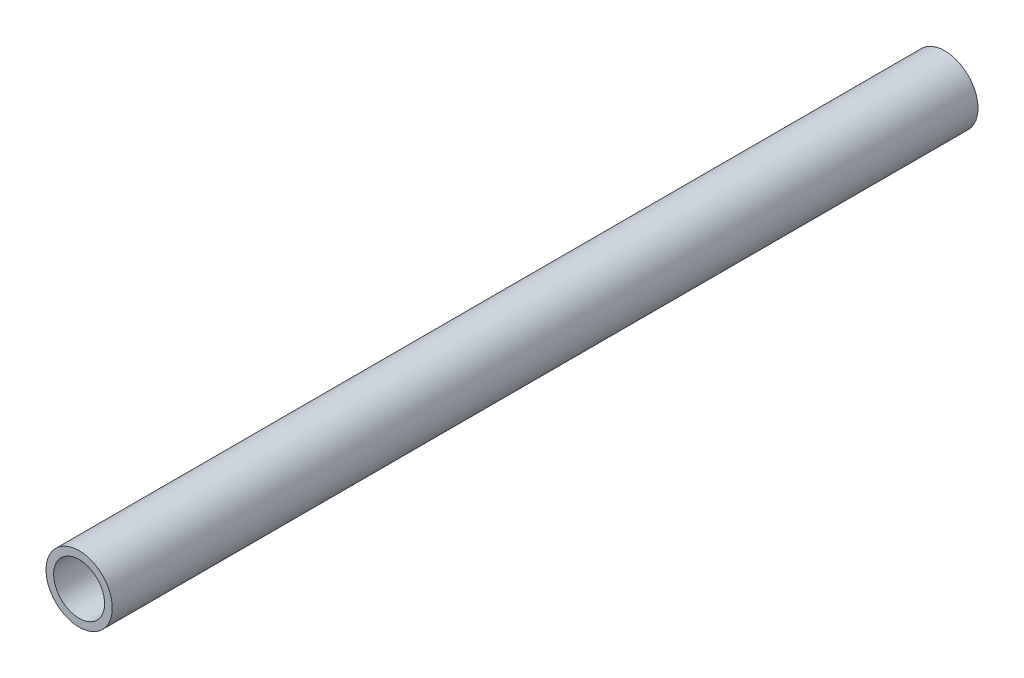
ISO-10303-21;
HEADER;
FILE_DESCRIPTION(('STEP AP214'),'2;1');
FILE_NAME('part.step','',(''),(''),'','','');
FILE_SCHEMA(('AUTOMOTIVE_DESIGN { 1 0 10303 214 1 1 1 1 }'));
ENDSEC;
DATA;
#1=APPLICATION_CONTEXT('core data for automotive mechanical design processes');
#2=APPLICATION_PROTOCOL_DEFINITION('international standard','automotive_design',2000,#1);
#3=PRODUCT_CONTEXT('',#1,'mechanical');
#4=PRODUCT('Part','Part','',(#3));
#5=PRODUCT_RELATED_PRODUCT_CATEGORY('part','',(#4));
#6=PRODUCT_DEFINITION_FORMATION('','',#4);
#7=PRODUCT_DEFINITION_CONTEXT('part definition',#1,'design');
#8=PRODUCT_DEFINITION('design','',#6,#7);
#9=PRODUCT_DEFINITION_SHAPE('','',#8);
#10=(LENGTH_UNIT() NAMED_UNIT(*) SI_UNIT(.MILLI.,.METRE.));
#11=(NAMED_UNIT(*) PLANE_ANGLE_UNIT() SI_UNIT($,.RADIAN.));
#12=(NAMED_UNIT(*) SI_UNIT($,.STERADIAN.) SOLID_ANGLE_UNIT());
#13=UNCERTAINTY_MEASURE_WITH_UNIT(LENGTH_MEASURE(1.E-05),#10,'distance_accuracy_value','');
#14=(GEOMETRIC_REPRESENTATION_CONTEXT(3) GLOBAL_UNCERTAINTY_ASSIGNED_CONTEXT((#13)) GLOBAL_UNIT_ASSIGNED_CONTEXT((#10,
#11,#12)) REPRESENTATION_CONTEXT('',''));
#15=CARTESIAN_POINT('',(0.,0.,0.));
#16=DIRECTION('',(0.,0.,1.));
#17=DIRECTION('',(1.,0.,0.));
#18=AXIS2_PLACEMENT_3D('',#15,#16,#17);
#19=CARTESIAN_POINT('',(0.,0.,0.));
#20=DIRECTION('',(0.,0.,1.));
#21=DIRECTION('',(1.,0.,0.));
#22=AXIS2_PLACEMENT_3D('',#19,#20,#21);
#23=PLANE('',#22);
#24=CARTESIAN_POINT('',(0.,0.,0.));
#25=DIRECTION('',(0.,0.,1.));
#26=DIRECTION('',(1.,0.,0.));
#27=AXIS2_PLACEMENT_3D('',#24,#25,#26);
#28=CIRCLE('',#27,16.51);
#29=CARTESIAN_POINT('',(16.51,0.,0.));
#30=VERTEX_POINT('',#29);
#31=EDGE_CURVE('E38',#30,#30,#28,.T.);
#32=ORIENTED_EDGE('',*,*,#31,.F.);
#33=EDGE_LOOP('',(#32));
#34=FACE_BOUND('',#33,.T.);
#35=CARTESIAN_POINT('',(0.,0.,0.));
#36=DIRECTION('',(0.,0.,1.));
#37=DIRECTION('',(1.,0.,0.));
#38=AXIS2_PLACEMENT_3D('',#35,#36,#37);
#39=CIRCLE('',#38,12.7);
#40=CARTESIAN_POINT('',(12.7,0.,0.));
#41=VERTEX_POINT('',#40);
#42=EDGE_CURVE('E47',#41,#41,#39,.T.);
#43=ORIENTED_EDGE('',*,*,#42,.T.);
#44=EDGE_LOOP('',(#43));
#45=FACE_BOUND('',#44,.T.);
#46=ADVANCED_FACE('F31',(#34,#45),#23,.F.);
#47=CARTESIAN_POINT('',(0.,0.,477.98933182956));
#48=DIRECTION('',(0.,0.,-1.));
#49=DIRECTION('',(-1.,0.,0.));
#50=AXIS2_PLACEMENT_3D('',#47,#48,#49);
#51=CYLINDRICAL_SURFACE('',#50,16.51);
#52=CARTESIAN_POINT('',(0.,0.,431.292));
#53=DIRECTION('',(0.,0.,-1.));
#54=DIRECTION('',(0.,1.,0.));
#55=AXIS2_PLACEMENT_3D('',#52,#53,#54);
#56=CIRCLE('',#55,16.51);
#57=CARTESIAN_POINT('',(0.,16.51,431.292));
#58=VERTEX_POINT('',#57);
#59=EDGE_CURVE('E42',#58,#58,#56,.T.);
#60=ORIENTED_EDGE('',*,*,#59,.T.);
#61=EDGE_LOOP('',(#60));
#62=FACE_BOUND('',#61,.T.);
#63=ORIENTED_EDGE('',*,*,#31,.T.);
#64=EDGE_LOOP('',(#63));
#65=FACE_BOUND('',#64,.T.);
#66=ADVANCED_FACE('F55',(#62,#65),#51,.T.);
#67=CARTESIAN_POINT('',(0.,0.,477.98933182956));
#68=DIRECTION('',(0.,0.,-1.));
#69=DIRECTION('',(-1.,0.,0.));
#70=AXIS2_PLACEMENT_3D('',#67,#68,#69);
#71=CYLINDRICAL_SURFACE('',#70,12.7);
#72=CARTESIAN_POINT('',(0.,0.,431.292));
#73=DIRECTION('',(0.,0.,-1.));
#74=DIRECTION('',(0.,1.,0.));
#75=AXIS2_PLACEMENT_3D('',#72,#73,#74);
#76=CIRCLE('',#75,12.7);
#77=CARTESIAN_POINT('',(0.,12.7,431.292));
#78=VERTEX_POINT('',#77);
#79=EDGE_CURVE('E10',#78,#78,#76,.T.);
#80=ORIENTED_EDGE('',*,*,#79,.F.);
#81=EDGE_LOOP('',(#80));
#82=FACE_BOUND('',#81,.T.);
#83=ORIENTED_EDGE('',*,*,#42,.F.);
#84=EDGE_LOOP('',(#83));
#85=FACE_BOUND('',#84,.T.);
#86=ADVANCED_FACE('F53',(#82,#85),#71,.F.);
#87=CARTESIAN_POINT('',(-7.94015028823708,-25.4606149454448,431.292));
#88=DIRECTION('',(0.,0.,-1.));
#89=DIRECTION('',(0.,1.,0.));
#90=AXIS2_PLACEMENT_3D('',#87,#88,#89);
#91=PLANE('',#90);
#92=ORIENTED_EDGE('',*,*,#79,.T.);
#93=EDGE_LOOP('',(#92));
#94=FACE_BOUND('',#93,.T.);
#95=ORIENTED_EDGE('',*,*,#59,.F.);
#96=EDGE_LOOP('',(#95));
#97=FACE_BOUND('',#96,.T.);
#98=ADVANCED_FACE('F33',(#94,#97),#91,.F.);
#99=CLOSED_SHELL('',(#46,#66,#86,#98));
#100=MANIFOLD_SOLID_BREP('B2',#99);
#101=ADVANCED_BREP_SHAPE_REPRESENTATION('',(#18,#100),#14);
#102=SHAPE_DEFINITION_REPRESENTATION(#9,#101);
ENDSEC;
END-ISO-10303-21;
